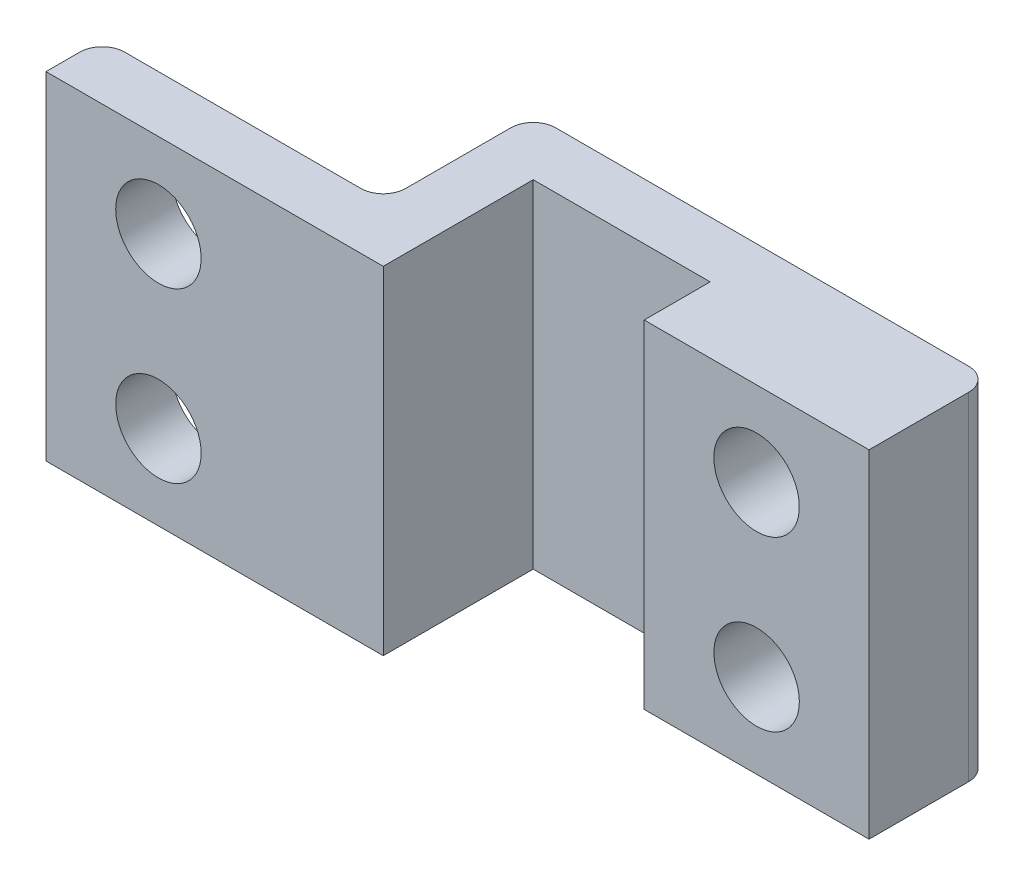
ISO-10303-21;
HEADER;
FILE_DESCRIPTION(('STEP AP214'),'2;1');
FILE_NAME('part.step','',(''),(''),'','','');
FILE_SCHEMA(('AUTOMOTIVE_DESIGN { 1 0 10303 214 1 1 1 1 }'));
ENDSEC;
DATA;
#1=APPLICATION_CONTEXT('core data for automotive mechanical design processes');
#2=APPLICATION_PROTOCOL_DEFINITION('international standard','automotive_design',2000,#1);
#3=PRODUCT_CONTEXT('',#1,'mechanical');
#4=PRODUCT('Part','Part','',(#3));
#5=PRODUCT_RELATED_PRODUCT_CATEGORY('part','',(#4));
#6=PRODUCT_DEFINITION_FORMATION('','',#4);
#7=PRODUCT_DEFINITION_CONTEXT('part definition',#1,'design');
#8=PRODUCT_DEFINITION('design','',#6,#7);
#9=PRODUCT_DEFINITION_SHAPE('','',#8);
#10=(LENGTH_UNIT() NAMED_UNIT(*) SI_UNIT(.MILLI.,.METRE.));
#11=(NAMED_UNIT(*) PLANE_ANGLE_UNIT() SI_UNIT($,.RADIAN.));
#12=(NAMED_UNIT(*) SI_UNIT($,.STERADIAN.) SOLID_ANGLE_UNIT());
#13=UNCERTAINTY_MEASURE_WITH_UNIT(LENGTH_MEASURE(1.E-05),#10,'distance_accuracy_value','');
#14=(GEOMETRIC_REPRESENTATION_CONTEXT(3) GLOBAL_UNCERTAINTY_ASSIGNED_CONTEXT((#13)) GLOBAL_UNIT_ASSIGNED_CONTEXT((#10,
#11,#12)) REPRESENTATION_CONTEXT('',''));
#15=CARTESIAN_POINT('',(0.,0.,0.));
#16=DIRECTION('',(0.,0.,1.));
#17=DIRECTION('',(1.,0.,0.));
#18=AXIS2_PLACEMENT_3D('',#15,#16,#17);
#19=CARTESIAN_POINT('',(64.4398,19.05,-16.9418));
#20=DIRECTION('',(0.,0.,-1.));
#21=DIRECTION('',(0.,1.,0.));
#22=AXIS2_PLACEMENT_3D('',#19,#20,#21);
#23=PLANE('',#22);
#24=DIRECTION('',(0.,-1.,0.));
#25=VECTOR('',#24,1.);
#26=CARTESIAN_POINT('',(39.0398,19.05,-16.9418));
#27=LINE('',#26,#25);
#28=CARTESIAN_POINT('',(39.0398,19.05,-16.9418));
#29=VERTEX_POINT('',#28);
#30=CARTESIAN_POINT('',(39.0398,-19.05,-16.9418));
#31=VERTEX_POINT('',#30);
#32=EDGE_CURVE('E162',#29,#31,#27,.T.);
#33=ORIENTED_EDGE('',*,*,#32,.F.);
#34=DIRECTION('',(-1.,0.,0.));
#35=VECTOR('',#34,1.);
#36=CARTESIAN_POINT('',(64.4398,19.05,-16.9418));
#37=LINE('',#36,#35);
#38=CARTESIAN_POINT('',(19.05,19.05,-16.9418));
#39=VERTEX_POINT('',#38);
#40=EDGE_CURVE('E181',#29,#39,#37,.T.);
#41=ORIENTED_EDGE('',*,*,#40,.T.);
#42=DIRECTION('',(0.,-1.,0.));
#43=VECTOR('',#42,1.);
#44=CARTESIAN_POINT('',(19.05,19.05,-16.9418));
#45=LINE('',#44,#43);
#46=CARTESIAN_POINT('',(19.05,-19.05,-16.9418));
#47=VERTEX_POINT('',#46);
#48=EDGE_CURVE('E146',#39,#47,#45,.T.);
#49=ORIENTED_EDGE('',*,*,#48,.T.);
#50=DIRECTION('',(-1.,0.,0.));
#51=VECTOR('',#50,1.);
#52=CARTESIAN_POINT('',(64.4398,-19.05,-16.9418));
#53=LINE('',#52,#51);
#54=EDGE_CURVE('E177',#31,#47,#53,.T.);
#55=ORIENTED_EDGE('',*,*,#54,.F.);
#56=EDGE_LOOP('',(#33,#41,#49,#55));
#57=FACE_BOUND('',#56,.T.);
#58=ADVANCED_FACE('F35',(#57),#23,.F.);
#59=CARTESIAN_POINT('',(19.05,-19.05,-6.35));
#60=DIRECTION('',(1.,0.,0.));
#61=DIRECTION('',(0.,0.,-1.));
#62=AXIS2_PLACEMENT_3D('',#59,#60,#61);
#63=PLANE('',#62);
#64=ORIENTED_EDGE('',*,*,#48,.F.);
#65=DIRECTION('',(0.,0.,1.));
#66=VECTOR('',#65,1.);
#67=CARTESIAN_POINT('',(19.05,19.05,-6.35));
#68=LINE('',#67,#66);
#69=CARTESIAN_POINT('',(19.05,19.05,0.));
#70=VERTEX_POINT('',#69);
#71=EDGE_CURVE('E201',#39,#70,#68,.T.);
#72=ORIENTED_EDGE('',*,*,#71,.T.);
#73=DIRECTION('',(0.,1.,0.));
#74=VECTOR('',#73,1.);
#75=CARTESIAN_POINT('',(19.05,-19.05,0.));
#76=LINE('',#75,#74);
#77=CARTESIAN_POINT('',(19.05,-19.05,0.));
#78=VERTEX_POINT('',#77);
#79=EDGE_CURVE('E194',#78,#70,#76,.T.);
#80=ORIENTED_EDGE('',*,*,#79,.F.);
#81=DIRECTION('',(0.,0.,1.));
#82=VECTOR('',#81,1.);
#83=CARTESIAN_POINT('',(19.05,-19.05,-6.35));
#84=LINE('',#83,#82);
#85=EDGE_CURVE('E212',#47,#78,#84,.T.);
#86=ORIENTED_EDGE('',*,*,#85,.F.);
#87=EDGE_LOOP('',(#64,#72,#80,#86));
#88=FACE_BOUND('',#87,.T.);
#89=ADVANCED_FACE('F280',(#88),#63,.T.);
#90=CARTESIAN_POINT('',(-19.05,-19.05,-6.35));
#91=DIRECTION('',(0.,-1.,0.));
#92=DIRECTION('',(0.,0.,-1.));
#93=AXIS2_PLACEMENT_3D('',#90,#91,#92);
#94=PLANE('',#93);
#95=DIRECTION('',(0.,0.,1.));
#96=VECTOR('',#95,1.);
#97=CARTESIAN_POINT('',(-19.05,-19.05,-6.35));
#98=LINE('',#97,#96);
#99=CARTESIAN_POINT('',(-19.05,-19.05,-3.81));
#100=VERTEX_POINT('',#99);
#101=CARTESIAN_POINT('',(-19.05,-19.05,0.));
#102=VERTEX_POINT('',#101);
#103=EDGE_CURVE('E215',#100,#102,#98,.T.);
#104=ORIENTED_EDGE('',*,*,#103,.F.);
#105=CARTESIAN_POINT('',(-16.51,-19.05,-3.81));
#106=DIRECTION('',(0.,-1.,0.));
#107=DIRECTION('',(0.,0.,-1.));
#108=AXIS2_PLACEMENT_3D('',#105,#106,#107);
#109=CIRCLE('',#108,2.54);
#110=CARTESIAN_POINT('',(-16.51,-19.05,-6.35));
#111=VERTEX_POINT('',#110);
#112=EDGE_CURVE('E226',#100,#111,#109,.T.);
#113=ORIENTED_EDGE('',*,*,#112,.T.);
#114=DIRECTION('',(1.,0.,0.));
#115=VECTOR('',#114,1.);
#116=CARTESIAN_POINT('',(-19.05,-19.05,-6.35));
#117=LINE('',#116,#115);
#118=CARTESIAN_POINT('',(10.16,-19.05,-6.35));
#119=VERTEX_POINT('',#118);
#120=EDGE_CURVE('E197',#111,#119,#117,.T.);
#121=ORIENTED_EDGE('',*,*,#120,.T.);
#122=CARTESIAN_POINT('',(10.16,-19.05,-8.89));
#123=DIRECTION('',(0.,-1.,0.));
#124=DIRECTION('',(0.,0.,-1.));
#125=AXIS2_PLACEMENT_3D('',#122,#123,#124);
#126=CIRCLE('',#125,2.54);
#127=CARTESIAN_POINT('',(12.7,-19.05,-8.89));
#128=VERTEX_POINT('',#127);
#129=EDGE_CURVE('E11',#119,#128,#126,.F.);
#130=ORIENTED_EDGE('',*,*,#129,.T.);
#131=DIRECTION('',(0.,0.,1.));
#132=VECTOR('',#131,1.);
#133=CARTESIAN_POINT('',(12.7,-19.05,-23.2918));
#134=LINE('',#133,#132);
#135=CARTESIAN_POINT('',(12.7,-19.05,-20.7518));
#136=VERTEX_POINT('',#135);
#137=EDGE_CURVE('E191',#136,#128,#134,.T.);
#138=ORIENTED_EDGE('',*,*,#137,.F.);
#139=CARTESIAN_POINT('',(15.24,-19.05,-20.7518));
#140=DIRECTION('',(0.,-1.,0.));
#141=DIRECTION('',(0.,0.,-1.));
#142=AXIS2_PLACEMENT_3D('',#139,#140,#141);
#143=CIRCLE('',#142,2.54);
#144=CARTESIAN_POINT('',(15.24,-19.05,-23.2918));
#145=VERTEX_POINT('',#144);
#146=EDGE_CURVE('E224',#136,#145,#143,.T.);
#147=ORIENTED_EDGE('',*,*,#146,.T.);
#148=DIRECTION('',(-1.,0.,0.));
#149=VECTOR('',#148,1.);
#150=CARTESIAN_POINT('',(19.05,-19.05,-23.2918));
#151=LINE('',#150,#149);
#152=CARTESIAN_POINT('',(61.8998,-19.05,-23.2918));
#153=VERTEX_POINT('',#152);
#154=EDGE_CURVE('E183',#153,#145,#151,.T.);
#155=ORIENTED_EDGE('',*,*,#154,.F.);
#156=CARTESIAN_POINT('',(61.8998,-19.05,-20.7518));
#157=DIRECTION('',(0.,-1.,0.));
#158=DIRECTION('',(0.,0.,-1.));
#159=AXIS2_PLACEMENT_3D('',#156,#157,#158);
#160=CIRCLE('',#159,2.54);
#161=CARTESIAN_POINT('',(64.4398,-19.05,-20.7518));
#162=VERTEX_POINT('',#161);
#163=EDGE_CURVE('E222',#153,#162,#160,.T.);
#164=ORIENTED_EDGE('',*,*,#163,.T.);
#165=DIRECTION('',(0.,0.,-1.));
#166=VECTOR('',#165,1.);
#167=CARTESIAN_POINT('',(64.4398,-19.05,-23.2918));
#168=LINE('',#167,#166);
#169=CARTESIAN_POINT('',(64.4398,-19.05,-9.4869));
#170=VERTEX_POINT('',#169);
#171=EDGE_CURVE('E145',#170,#162,#168,.T.);
#172=ORIENTED_EDGE('',*,*,#171,.F.);
#173=DIRECTION('',(1.,0.,0.));
#174=VECTOR('',#173,1.);
#175=CARTESIAN_POINT('',(64.4398,-19.05,-9.4869));
#176=LINE('',#175,#174);
#177=CARTESIAN_POINT('',(39.0398,-19.05,-9.4869));
#178=VERTEX_POINT('',#177);
#179=EDGE_CURVE('E161',#178,#170,#176,.T.);
#180=ORIENTED_EDGE('',*,*,#179,.F.);
#181=DIRECTION('',(0.,0.,-1.));
#182=VECTOR('',#181,1.);
#183=CARTESIAN_POINT('',(39.0398,-19.05,-9.4869));
#184=LINE('',#183,#182);
#185=EDGE_CURVE('E171',#178,#31,#184,.T.);
#186=ORIENTED_EDGE('',*,*,#185,.T.);
#187=ORIENTED_EDGE('',*,*,#54,.T.);
#188=ORIENTED_EDGE('',*,*,#85,.T.);
#189=DIRECTION('',(1.,0.,0.));
#190=VECTOR('',#189,1.);
#191=CARTESIAN_POINT('',(-19.05,-19.05,0.));
#192=LINE('',#191,#190);
#193=EDGE_CURVE('E198',#102,#78,#192,.T.);
#194=ORIENTED_EDGE('',*,*,#193,.F.);
#195=EDGE_LOOP('',(#104,#113,#121,#130,#138,#147,#155,#164,#172,#180,#186,#187,#188,#194));
#196=FACE_BOUND('',#195,.T.);
#197=ADVANCED_FACE('F257',(#196),#94,.T.);
#198=CARTESIAN_POINT('',(-19.05,-19.05,-6.35));
#199=DIRECTION('',(-1.,0.,0.));
#200=DIRECTION('',(0.,0.,1.));
#201=AXIS2_PLACEMENT_3D('',#198,#199,#200);
#202=PLANE('',#201);
#203=DIRECTION('',(0.,0.,1.));
#204=VECTOR('',#203,1.);
#205=CARTESIAN_POINT('',(-19.05,19.05,-6.35));
#206=LINE('',#205,#204);
#207=CARTESIAN_POINT('',(-19.05,19.05,-3.81));
#208=VERTEX_POINT('',#207);
#209=CARTESIAN_POINT('',(-19.05,19.05,0.));
#210=VERTEX_POINT('',#209);
#211=EDGE_CURVE('E217',#208,#210,#206,.T.);
#212=ORIENTED_EDGE('',*,*,#211,.F.);
#213=DIRECTION('',(0.,-1.,0.));
#214=VECTOR('',#213,1.);
#215=CARTESIAN_POINT('',(-19.05,-19.05,-3.81));
#216=LINE('',#215,#214);
#217=EDGE_CURVE('E214',#208,#100,#216,.T.);
#218=ORIENTED_EDGE('',*,*,#217,.T.);
#219=ORIENTED_EDGE('',*,*,#103,.T.);
#220=DIRECTION('',(0.,-1.,0.));
#221=VECTOR('',#220,1.);
#222=CARTESIAN_POINT('',(-19.05,-19.05,0.));
#223=LINE('',#222,#221);
#224=EDGE_CURVE('E207',#210,#102,#223,.T.);
#225=ORIENTED_EDGE('',*,*,#224,.F.);
#226=EDGE_LOOP('',(#212,#218,#219,#225));
#227=FACE_BOUND('',#226,.T.);
#228=ADVANCED_FACE('F289',(#227),#202,.T.);
#229=CARTESIAN_POINT('',(-19.05,19.05,-6.35));
#230=DIRECTION('',(0.,1.,0.));
#231=DIRECTION('',(0.,0.,1.));
#232=AXIS2_PLACEMENT_3D('',#229,#230,#231);
#233=PLANE('',#232);
#234=DIRECTION('',(-1.,0.,0.));
#235=VECTOR('',#234,1.);
#236=CARTESIAN_POINT('',(-19.05,19.05,-6.35));
#237=LINE('',#236,#235);
#238=CARTESIAN_POINT('',(10.16,19.05,-6.35));
#239=VERTEX_POINT('',#238);
#240=CARTESIAN_POINT('',(-16.51,19.05,-6.35));
#241=VERTEX_POINT('',#240);
#242=EDGE_CURVE('E195',#239,#241,#237,.T.);
#243=ORIENTED_EDGE('',*,*,#242,.T.);
#244=CARTESIAN_POINT('',(-16.51,19.05,-3.81));
#245=DIRECTION('',(0.,1.,0.));
#246=DIRECTION('',(0.,0.,1.));
#247=AXIS2_PLACEMENT_3D('',#244,#245,#246);
#248=CIRCLE('',#247,2.54);
#249=EDGE_CURVE('E235',#241,#208,#248,.T.);
#250=ORIENTED_EDGE('',*,*,#249,.T.);
#251=ORIENTED_EDGE('',*,*,#211,.T.);
#252=DIRECTION('',(-1.,0.,0.));
#253=VECTOR('',#252,1.);
#254=CARTESIAN_POINT('',(-19.05,19.05,0.));
#255=LINE('',#254,#253);
#256=EDGE_CURVE('E204',#70,#210,#255,.T.);
#257=ORIENTED_EDGE('',*,*,#256,.F.);
#258=ORIENTED_EDGE('',*,*,#71,.F.);
#259=ORIENTED_EDGE('',*,*,#40,.F.);
#260=DIRECTION('',(0.,0.,-1.));
#261=VECTOR('',#260,1.);
#262=CARTESIAN_POINT('',(39.0398,19.05,-9.4869));
#263=LINE('',#262,#261);
#264=CARTESIAN_POINT('',(39.0398,19.05,-9.4869));
#265=VERTEX_POINT('',#264);
#266=EDGE_CURVE('E153',#265,#29,#263,.T.);
#267=ORIENTED_EDGE('',*,*,#266,.F.);
#268=DIRECTION('',(-1.,0.,0.));
#269=VECTOR('',#268,1.);
#270=CARTESIAN_POINT('',(64.4398,19.05,-9.4869));
#271=LINE('',#270,#269);
#272=CARTESIAN_POINT('',(64.4398,19.05,-9.4869));
#273=VERTEX_POINT('',#272);
#274=EDGE_CURVE('E149',#273,#265,#271,.T.);
#275=ORIENTED_EDGE('',*,*,#274,.F.);
#276=DIRECTION('',(0.,0.,1.));
#277=VECTOR('',#276,1.);
#278=CARTESIAN_POINT('',(64.4398,19.05,-23.2918));
#279=LINE('',#278,#277);
#280=CARTESIAN_POINT('',(64.4398,19.05,-20.7518));
#281=VERTEX_POINT('',#280);
#282=EDGE_CURVE('E137',#281,#273,#279,.T.);
#283=ORIENTED_EDGE('',*,*,#282,.F.);
#284=CARTESIAN_POINT('',(61.8998,19.05,-20.7518));
#285=DIRECTION('',(0.,1.,0.));
#286=DIRECTION('',(0.,0.,1.));
#287=AXIS2_PLACEMENT_3D('',#284,#285,#286);
#288=CIRCLE('',#287,2.54);
#289=CARTESIAN_POINT('',(61.8998,19.05,-23.2918));
#290=VERTEX_POINT('',#289);
#291=EDGE_CURVE('E232',#281,#290,#288,.T.);
#292=ORIENTED_EDGE('',*,*,#291,.T.);
#293=DIRECTION('',(1.,0.,0.));
#294=VECTOR('',#293,1.);
#295=CARTESIAN_POINT('',(19.05,19.05,-23.2918));
#296=LINE('',#295,#294);
#297=CARTESIAN_POINT('',(15.24,19.05,-23.2918));
#298=VERTEX_POINT('',#297);
#299=EDGE_CURVE('E186',#298,#290,#296,.T.);
#300=ORIENTED_EDGE('',*,*,#299,.F.);
#301=CARTESIAN_POINT('',(15.24,19.05,-20.7518));
#302=DIRECTION('',(0.,1.,0.));
#303=DIRECTION('',(0.,0.,1.));
#304=AXIS2_PLACEMENT_3D('',#301,#302,#303);
#305=CIRCLE('',#304,2.54);
#306=CARTESIAN_POINT('',(12.7,19.05,-20.7518));
#307=VERTEX_POINT('',#306);
#308=EDGE_CURVE('E57',#298,#307,#305,.T.);
#309=ORIENTED_EDGE('',*,*,#308,.T.);
#310=DIRECTION('',(0.,0.,1.));
#311=VECTOR('',#310,1.);
#312=CARTESIAN_POINT('',(12.7,19.05,-23.2918));
#313=LINE('',#312,#311);
#314=CARTESIAN_POINT('',(12.7,19.05,-8.89));
#315=VERTEX_POINT('',#314);
#316=EDGE_CURVE('E189',#307,#315,#313,.T.);
#317=ORIENTED_EDGE('',*,*,#316,.T.);
#318=CARTESIAN_POINT('',(10.16,19.05,-8.89));
#319=DIRECTION('',(0.,1.,0.));
#320=DIRECTION('',(0.,0.,1.));
#321=AXIS2_PLACEMENT_3D('',#318,#319,#320);
#322=CIRCLE('',#321,2.54);
#323=EDGE_CURVE('E43',#315,#239,#322,.F.);
#324=ORIENTED_EDGE('',*,*,#323,.T.);
#325=EDGE_LOOP('',(#243,#250,#251,#257,#258,#259,#267,#275,#283,#292,#300,#309,#317,#324));
#326=FACE_BOUND('',#325,.T.);
#327=ADVANCED_FACE('F151',(#326),#233,.T.);
#328=CARTESIAN_POINT('',(0.,0.,-6.35));
#329=DIRECTION('',(0.,0.,-1.));
#330=DIRECTION('',(-1.,0.,0.));
#331=AXIS2_PLACEMENT_3D('',#328,#329,#330);
#332=PLANE('',#331);
#333=CARTESIAN_POINT('',(-6.35,9.525,-6.35));
#334=DIRECTION('',(0.,0.,-1.));
#335=DIRECTION('',(-1.,0.,0.));
#336=AXIS2_PLACEMENT_3D('',#333,#334,#335);
#337=CIRCLE('',#336,4.826);
#338=CARTESIAN_POINT('',(-11.176,9.525,-6.35));
#339=VERTEX_POINT('',#338);
#340=EDGE_CURVE('E506',#339,#339,#337,.T.);
#341=ORIENTED_EDGE('',*,*,#340,.F.);
#342=EDGE_LOOP('',(#341));
#343=FACE_BOUND('',#342,.T.);
#344=CARTESIAN_POINT('',(-6.35,-9.525,-6.35));
#345=DIRECTION('',(0.,0.,-1.));
#346=DIRECTION('',(1.,0.,0.));
#347=AXIS2_PLACEMENT_3D('',#344,#345,#346);
#348=CIRCLE('',#347,4.826);
#349=CARTESIAN_POINT('',(-1.524,-9.525,-6.35));
#350=VERTEX_POINT('',#349);
#351=EDGE_CURVE('E167',#350,#350,#348,.T.);
#352=ORIENTED_EDGE('',*,*,#351,.F.);
#353=EDGE_LOOP('',(#352));
#354=FACE_BOUND('',#353,.T.);
#355=ORIENTED_EDGE('',*,*,#120,.F.);
#356=DIRECTION('',(0.,-1.,0.));
#357=VECTOR('',#356,1.);
#358=CARTESIAN_POINT('',(-16.51,0.,-6.35));
#359=LINE('',#358,#357);
#360=EDGE_CURVE('E230',#111,#241,#359,.F.);
#361=ORIENTED_EDGE('',*,*,#360,.T.);
#362=ORIENTED_EDGE('',*,*,#242,.F.);
#363=DIRECTION('',(0.,1.,0.));
#364=VECTOR('',#363,1.);
#365=CARTESIAN_POINT('',(10.16,0.,-6.35));
#366=LINE('',#365,#364);
#367=EDGE_CURVE('E228',#239,#119,#366,.F.);
#368=ORIENTED_EDGE('',*,*,#367,.T.);
#369=EDGE_LOOP('',(#355,#361,#362,#368));
#370=FACE_BOUND('',#369,.T.);
#371=ADVANCED_FACE('F250',(#343,#354,#370),#332,.T.);
#372=CARTESIAN_POINT('',(0.,0.,0.));
#373=DIRECTION('',(0.,0.,-1.));
#374=DIRECTION('',(-1.,0.,0.));
#375=AXIS2_PLACEMENT_3D('',#372,#373,#374);
#376=PLANE('',#375);
#377=CARTESIAN_POINT('',(-6.35,9.525,0.));
#378=DIRECTION('',(0.,0.,-1.));
#379=DIRECTION('',(-1.,0.,0.));
#380=AXIS2_PLACEMENT_3D('',#377,#378,#379);
#381=CIRCLE('',#380,4.826);
#382=CARTESIAN_POINT('',(-11.176,9.525,0.));
#383=VERTEX_POINT('',#382);
#384=EDGE_CURVE('E164',#383,#383,#381,.T.);
#385=ORIENTED_EDGE('',*,*,#384,.T.);
#386=EDGE_LOOP('',(#385));
#387=FACE_BOUND('',#386,.T.);
#388=CARTESIAN_POINT('',(-6.35,-9.525,0.));
#389=DIRECTION('',(0.,0.,-1.));
#390=DIRECTION('',(1.,0.,0.));
#391=AXIS2_PLACEMENT_3D('',#388,#389,#390);
#392=CIRCLE('',#391,4.826);
#393=CARTESIAN_POINT('',(-1.524,-9.525,0.));
#394=VERTEX_POINT('',#393);
#395=EDGE_CURVE('E508',#394,#394,#392,.T.);
#396=ORIENTED_EDGE('',*,*,#395,.T.);
#397=EDGE_LOOP('',(#396));
#398=FACE_BOUND('',#397,.T.);
#399=ORIENTED_EDGE('',*,*,#79,.T.);
#400=ORIENTED_EDGE('',*,*,#256,.T.);
#401=ORIENTED_EDGE('',*,*,#224,.T.);
#402=ORIENTED_EDGE('',*,*,#193,.T.);
#403=EDGE_LOOP('',(#399,#400,#401,#402));
#404=FACE_BOUND('',#403,.T.);
#405=ADVANCED_FACE('F286',(#387,#398,#404),#376,.F.);
#406=CARTESIAN_POINT('',(12.7,19.05,-23.2918));
#407=DIRECTION('',(1.,0.,0.));
#408=DIRECTION('',(0.,1.,0.));
#409=AXIS2_PLACEMENT_3D('',#406,#407,#408);
#410=PLANE('',#409);
#411=ORIENTED_EDGE('',*,*,#137,.T.);
#412=DIRECTION('',(0.,1.,0.));
#413=VECTOR('',#412,1.);
#414=CARTESIAN_POINT('',(12.7,19.05,-8.89));
#415=LINE('',#414,#413);
#416=EDGE_CURVE('E239',#128,#315,#415,.T.);
#417=ORIENTED_EDGE('',*,*,#416,.T.);
#418=ORIENTED_EDGE('',*,*,#316,.F.);
#419=DIRECTION('',(0.,1.,0.));
#420=VECTOR('',#419,1.);
#421=CARTESIAN_POINT('',(12.7,-19.05,-20.7518));
#422=LINE('',#421,#420);
#423=EDGE_CURVE('E237',#307,#136,#422,.F.);
#424=ORIENTED_EDGE('',*,*,#423,.T.);
#425=EDGE_LOOP('',(#411,#417,#418,#424));
#426=FACE_BOUND('',#425,.T.);
#427=ADVANCED_FACE('F260',(#426),#410,.F.);
#428=CARTESIAN_POINT('',(0.,0.,-23.2918));
#429=DIRECTION('',(0.,0.,-1.));
#430=DIRECTION('',(-1.,0.,0.));
#431=AXIS2_PLACEMENT_3D('',#428,#429,#430);
#432=PLANE('',#431);
#433=CARTESIAN_POINT('',(51.7398,-9.525,-23.2918));
#434=DIRECTION('',(0.,0.,1.));
#435=DIRECTION('',(1.,0.,0.));
#436=AXIS2_PLACEMENT_3D('',#433,#434,#435);
#437=CIRCLE('',#436,4.826);
#438=CARTESIAN_POINT('',(56.5658,-9.525,-23.2918));
#439=VERTEX_POINT('',#438);
#440=EDGE_CURVE('E513',#439,#439,#437,.T.);
#441=ORIENTED_EDGE('',*,*,#440,.T.);
#442=EDGE_LOOP('',(#441));
#443=FACE_BOUND('',#442,.T.);
#444=CARTESIAN_POINT('',(51.7398,9.52499999999998,-23.2918));
#445=DIRECTION('',(0.,0.,1.));
#446=DIRECTION('',(-1.,0.,0.));
#447=AXIS2_PLACEMENT_3D('',#444,#445,#446);
#448=CIRCLE('',#447,4.826);
#449=CARTESIAN_POINT('',(46.9138,9.52499999999998,-23.2918));
#450=VERTEX_POINT('',#449);
#451=EDGE_CURVE('E494',#450,#450,#448,.T.);
#452=ORIENTED_EDGE('',*,*,#451,.T.);
#453=EDGE_LOOP('',(#452));
#454=FACE_BOUND('',#453,.T.);
#455=ORIENTED_EDGE('',*,*,#154,.T.);
#456=DIRECTION('',(0.,1.,0.));
#457=VECTOR('',#456,1.);
#458=CARTESIAN_POINT('',(15.24,19.05,-23.2918));
#459=LINE('',#458,#457);
#460=EDGE_CURVE('E243',#145,#298,#459,.T.);
#461=ORIENTED_EDGE('',*,*,#460,.T.);
#462=ORIENTED_EDGE('',*,*,#299,.T.);
#463=DIRECTION('',(0.,1.,0.));
#464=VECTOR('',#463,1.);
#465=CARTESIAN_POINT('',(61.8998,-19.05,-23.2918));
#466=LINE('',#465,#464);
#467=EDGE_CURVE('E241',#290,#153,#466,.F.);
#468=ORIENTED_EDGE('',*,*,#467,.T.);
#469=EDGE_LOOP('',(#455,#461,#462,#468));
#470=FACE_BOUND('',#469,.T.);
#471=ADVANCED_FACE('F268',(#443,#454,#470),#432,.T.);
#472=CARTESIAN_POINT('',(64.4398,0.,0.));
#473=DIRECTION('',(-1.,0.,0.));
#474=DIRECTION('',(0.,0.,1.));
#475=AXIS2_PLACEMENT_3D('',#472,#473,#474);
#476=PLANE('',#475);
#477=ORIENTED_EDGE('',*,*,#171,.T.);
#478=DIRECTION('',(0.,1.,0.));
#479=VECTOR('',#478,1.);
#480=CARTESIAN_POINT('',(64.4398,19.05,-20.7518));
#481=LINE('',#480,#479);
#482=EDGE_CURVE('E144',#162,#281,#481,.T.);
#483=ORIENTED_EDGE('',*,*,#482,.T.);
#484=ORIENTED_EDGE('',*,*,#282,.T.);
#485=DIRECTION('',(0.,1.,0.));
#486=VECTOR('',#485,1.);
#487=CARTESIAN_POINT('',(64.4398,19.05,-9.4869));
#488=LINE('',#487,#486);
#489=EDGE_CURVE('E142',#170,#273,#488,.T.);
#490=ORIENTED_EDGE('',*,*,#489,.F.);
#491=EDGE_LOOP('',(#477,#483,#484,#490));
#492=FACE_BOUND('',#491,.T.);
#493=ADVANCED_FACE('F140',(#492),#476,.F.);
#494=CARTESIAN_POINT('',(39.0398,19.05,-9.4869));
#495=DIRECTION('',(1.,0.,0.));
#496=DIRECTION('',(0.,0.,-1.));
#497=AXIS2_PLACEMENT_3D('',#494,#495,#496);
#498=PLANE('',#497);
#499=ORIENTED_EDGE('',*,*,#32,.T.);
#500=ORIENTED_EDGE('',*,*,#185,.F.);
#501=DIRECTION('',(0.,-1.,0.));
#502=VECTOR('',#501,1.);
#503=CARTESIAN_POINT('',(39.0398,19.05,-9.4869));
#504=LINE('',#503,#502);
#505=EDGE_CURVE('E156',#265,#178,#504,.T.);
#506=ORIENTED_EDGE('',*,*,#505,.F.);
#507=ORIENTED_EDGE('',*,*,#266,.T.);
#508=EDGE_LOOP('',(#499,#500,#506,#507));
#509=FACE_BOUND('',#508,.T.);
#510=ADVANCED_FACE('F357',(#509),#498,.F.);
#511=CARTESIAN_POINT('',(0.,0.,-9.4869));
#512=DIRECTION('',(0.,0.,-1.));
#513=DIRECTION('',(-1.,0.,0.));
#514=AXIS2_PLACEMENT_3D('',#511,#512,#513);
#515=PLANE('',#514);
#516=CARTESIAN_POINT('',(51.7398,-9.525,-9.4869));
#517=DIRECTION('',(0.,0.,1.));
#518=DIRECTION('',(1.,0.,0.));
#519=AXIS2_PLACEMENT_3D('',#516,#517,#518);
#520=CIRCLE('',#519,4.826);
#521=CARTESIAN_POINT('',(56.5658,-9.525,-9.4869));
#522=VERTEX_POINT('',#521);
#523=EDGE_CURVE('E500',#522,#522,#520,.T.);
#524=ORIENTED_EDGE('',*,*,#523,.F.);
#525=EDGE_LOOP('',(#524));
#526=FACE_BOUND('',#525,.T.);
#527=CARTESIAN_POINT('',(51.7398,9.52499999999998,-9.4869));
#528=DIRECTION('',(0.,0.,1.));
#529=DIRECTION('',(-1.,0.,0.));
#530=AXIS2_PLACEMENT_3D('',#527,#528,#529);
#531=CIRCLE('',#530,4.826);
#532=CARTESIAN_POINT('',(46.9138,9.52499999999998,-9.4869));
#533=VERTEX_POINT('',#532);
#534=EDGE_CURVE('E497',#533,#533,#531,.T.);
#535=ORIENTED_EDGE('',*,*,#534,.F.);
#536=EDGE_LOOP('',(#535));
#537=FACE_BOUND('',#536,.T.);
#538=ORIENTED_EDGE('',*,*,#489,.T.);
#539=ORIENTED_EDGE('',*,*,#274,.T.);
#540=ORIENTED_EDGE('',*,*,#505,.T.);
#541=ORIENTED_EDGE('',*,*,#179,.T.);
#542=EDGE_LOOP('',(#538,#539,#540,#541));
#543=FACE_BOUND('',#542,.T.);
#544=ADVANCED_FACE('F159',(#526,#537,#543),#515,.F.);
#545=CARTESIAN_POINT('',(-6.35,-9.525,0.));
#546=DIRECTION('',(0.,0.,-1.));
#547=DIRECTION('',(-1.,0.,0.));
#548=AXIS2_PLACEMENT_3D('',#545,#546,#547);
#549=CYLINDRICAL_SURFACE('',#548,4.826);
#550=ORIENTED_EDGE('',*,*,#395,.F.);
#551=EDGE_LOOP('',(#550));
#552=FACE_BOUND('',#551,.T.);
#553=ORIENTED_EDGE('',*,*,#351,.T.);
#554=EDGE_LOOP('',(#553));
#555=FACE_BOUND('',#554,.T.);
#556=ADVANCED_FACE('F367',(#552,#555),#549,.F.);
#557=CARTESIAN_POINT('',(-6.35,9.525,0.));
#558=DIRECTION('',(0.,0.,-1.));
#559=DIRECTION('',(-1.,0.,0.));
#560=AXIS2_PLACEMENT_3D('',#557,#558,#559);
#561=CYLINDRICAL_SURFACE('',#560,4.826);
#562=ORIENTED_EDGE('',*,*,#384,.F.);
#563=EDGE_LOOP('',(#562));
#564=FACE_BOUND('',#563,.T.);
#565=ORIENTED_EDGE('',*,*,#340,.T.);
#566=EDGE_LOOP('',(#565));
#567=FACE_BOUND('',#566,.T.);
#568=ADVANCED_FACE('F376',(#564,#567),#561,.F.);
#569=CARTESIAN_POINT('',(51.7398,9.52499999999998,-23.2918));
#570=DIRECTION('',(0.,0.,1.));
#571=DIRECTION('',(1.,0.,0.));
#572=AXIS2_PLACEMENT_3D('',#569,#570,#571);
#573=CYLINDRICAL_SURFACE('',#572,4.826);
#574=ORIENTED_EDGE('',*,*,#451,.F.);
#575=EDGE_LOOP('',(#574));
#576=FACE_BOUND('',#575,.T.);
#577=ORIENTED_EDGE('',*,*,#534,.T.);
#578=EDGE_LOOP('',(#577));
#579=FACE_BOUND('',#578,.T.);
#580=ADVANCED_FACE('F301',(#576,#579),#573,.F.);
#581=CARTESIAN_POINT('',(51.7398,-9.525,-23.2918));
#582=DIRECTION('',(0.,0.,1.));
#583=DIRECTION('',(1.,0.,0.));
#584=AXIS2_PLACEMENT_3D('',#581,#582,#583);
#585=CYLINDRICAL_SURFACE('',#584,4.826);
#586=ORIENTED_EDGE('',*,*,#440,.F.);
#587=EDGE_LOOP('',(#586));
#588=FACE_BOUND('',#587,.T.);
#589=ORIENTED_EDGE('',*,*,#523,.T.);
#590=EDGE_LOOP('',(#589));
#591=FACE_BOUND('',#590,.T.);
#592=ADVANCED_FACE('F294',(#588,#591),#585,.F.);
#593=CARTESIAN_POINT('',(-16.51,-19.05,-3.81));
#594=DIRECTION('',(0.,-1.,0.));
#595=DIRECTION('',(0.,0.,-1.));
#596=AXIS2_PLACEMENT_3D('',#593,#594,#595);
#597=CYLINDRICAL_SURFACE('',#596,2.54);
#598=ORIENTED_EDGE('',*,*,#249,.F.);
#599=ORIENTED_EDGE('',*,*,#360,.F.);
#600=ORIENTED_EDGE('',*,*,#112,.F.);
#601=ORIENTED_EDGE('',*,*,#217,.F.);
#602=EDGE_LOOP('',(#598,#599,#600,#601));
#603=FACE_BOUND('',#602,.T.);
#604=ADVANCED_FACE('F292',(#603),#597,.T.);
#605=CARTESIAN_POINT('',(10.16,19.05,-8.89));
#606=DIRECTION('',(0.,1.,0.));
#607=DIRECTION('',(-1.,0.,0.));
#608=AXIS2_PLACEMENT_3D('',#605,#606,#607);
#609=CYLINDRICAL_SURFACE('',#608,2.54);
#610=ORIENTED_EDGE('',*,*,#129,.F.);
#611=ORIENTED_EDGE('',*,*,#367,.F.);
#612=ORIENTED_EDGE('',*,*,#323,.F.);
#613=ORIENTED_EDGE('',*,*,#416,.F.);
#614=EDGE_LOOP('',(#610,#611,#612,#613));
#615=FACE_BOUND('',#614,.T.);
#616=ADVANCED_FACE('F253',(#615),#609,.F.);
#617=CARTESIAN_POINT('',(15.24,0.,-20.7518));
#618=DIRECTION('',(0.,-1.,0.));
#619=DIRECTION('',(1.,0.,0.));
#620=AXIS2_PLACEMENT_3D('',#617,#618,#619);
#621=CYLINDRICAL_SURFACE('',#620,2.54);
#622=ORIENTED_EDGE('',*,*,#146,.F.);
#623=ORIENTED_EDGE('',*,*,#423,.F.);
#624=ORIENTED_EDGE('',*,*,#308,.F.);
#625=ORIENTED_EDGE('',*,*,#460,.F.);
#626=EDGE_LOOP('',(#622,#623,#624,#625));
#627=FACE_BOUND('',#626,.T.);
#628=ADVANCED_FACE('F263',(#627),#621,.T.);
#629=CARTESIAN_POINT('',(61.8998,0.,-20.7518));
#630=DIRECTION('',(0.,-1.,0.));
#631=DIRECTION('',(0.,0.,-1.));
#632=AXIS2_PLACEMENT_3D('',#629,#630,#631);
#633=CYLINDRICAL_SURFACE('',#632,2.54);
#634=ORIENTED_EDGE('',*,*,#163,.F.);
#635=ORIENTED_EDGE('',*,*,#467,.F.);
#636=ORIENTED_EDGE('',*,*,#291,.F.);
#637=ORIENTED_EDGE('',*,*,#482,.F.);
#638=EDGE_LOOP('',(#634,#635,#636,#637));
#639=FACE_BOUND('',#638,.T.);
#640=ADVANCED_FACE('F37',(#639),#633,.T.);
#641=CLOSED_SHELL('',(#58,#89,#197,#228,#327,#371,#405,#427,#471,#493,#510,#544,#556,#568,#580,
#592,#604,#616,#628,#640));
#642=MANIFOLD_SOLID_BREP('B2',#641);
#643=ADVANCED_BREP_SHAPE_REPRESENTATION('',(#18,#642),#14);
#644=SHAPE_DEFINITION_REPRESENTATION(#9,#643);
ENDSEC;
END-ISO-10303-21;
